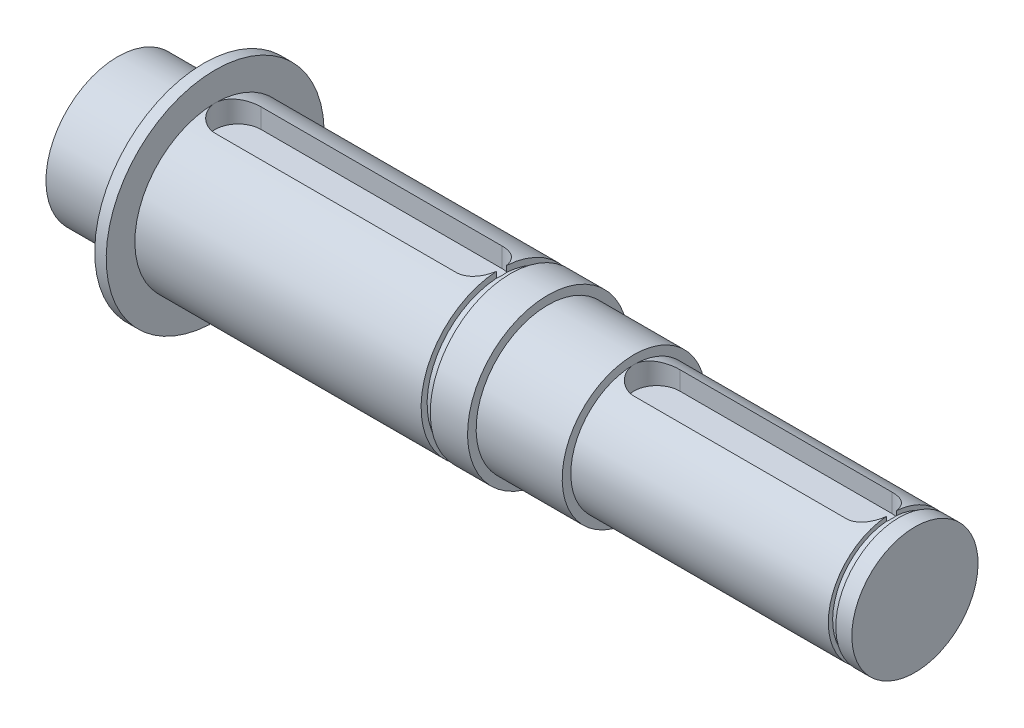
ISO-10303-21;
HEADER;
FILE_DESCRIPTION(('STEP AP214'),'2;1');
FILE_NAME('part.step','',(''),(''),'','','');
FILE_SCHEMA(('AUTOMOTIVE_DESIGN { 1 0 10303 214 1 1 1 1 }'));
ENDSEC;
DATA;
#1=APPLICATION_CONTEXT('core data for automotive mechanical design processes');
#2=APPLICATION_PROTOCOL_DEFINITION('international standard','automotive_design',2000,#1);
#3=PRODUCT_CONTEXT('',#1,'mechanical');
#4=PRODUCT('Part','Part','',(#3));
#5=PRODUCT_RELATED_PRODUCT_CATEGORY('part','',(#4));
#6=PRODUCT_DEFINITION_FORMATION('','',#4);
#7=PRODUCT_DEFINITION_CONTEXT('part definition',#1,'design');
#8=PRODUCT_DEFINITION('design','',#6,#7);
#9=PRODUCT_DEFINITION_SHAPE('','',#8);
#10=(LENGTH_UNIT() NAMED_UNIT(*) SI_UNIT(.MILLI.,.METRE.));
#11=(NAMED_UNIT(*) PLANE_ANGLE_UNIT() SI_UNIT($,.RADIAN.));
#12=(NAMED_UNIT(*) SI_UNIT($,.STERADIAN.) SOLID_ANGLE_UNIT());
#13=UNCERTAINTY_MEASURE_WITH_UNIT(LENGTH_MEASURE(1.E-05),#10,'distance_accuracy_value','');
#14=(GEOMETRIC_REPRESENTATION_CONTEXT(3) GLOBAL_UNCERTAINTY_ASSIGNED_CONTEXT((#13)) GLOBAL_UNIT_ASSIGNED_CONTEXT((#10,
#11,#12)) REPRESENTATION_CONTEXT('',''));
#15=CARTESIAN_POINT('',(0.,0.,0.));
#16=DIRECTION('',(0.,0.,1.));
#17=DIRECTION('',(1.,0.,0.));
#18=AXIS2_PLACEMENT_3D('',#15,#16,#17);
#19=CARTESIAN_POINT('',(139.,0.,0.));
#20=DIRECTION('',(1.,0.,0.));
#21=DIRECTION('',(0.,1.,0.));
#22=AXIS2_PLACEMENT_3D('',#19,#20,#21);
#23=CYLINDRICAL_SURFACE('',#22,11.);
#24=CARTESIAN_POINT('',(131.,10.2469507659596,-4.));
#25=CARTESIAN_POINT('',(131.108477558843,10.2469313120545,-4.00001506629618));
#26=CARTESIAN_POINT('',(131.216944401371,10.2486728711533,-3.99558759654818));
#27=CARTESIAN_POINT('',(131.433022618368,10.2555329689245,-3.97796511816532));
#28=CARTESIAN_POINT('',(131.540634252842,10.2606504381169,-3.96477288617617));
#29=CARTESIAN_POINT('',(131.753877275735,10.2740947544928,-3.92979740032968));
#30=CARTESIAN_POINT('',(131.85951412169,10.2824107118169,-3.90804329121768));
#31=CARTESIAN_POINT('',(132.068411897693,10.3019741161438,-3.85617600406601));
#32=CARTESIAN_POINT('',(132.171672716831,10.3132216996918,-3.82606243666697));
#33=CARTESIAN_POINT('',(132.476676115778,10.3508476988465,-3.72361404417547));
#34=CARTESIAN_POINT('',(132.674001570272,10.3811339859163,-3.6391113549248));
#35=CARTESIAN_POINT('',(133.05172943459,10.4486780931695,-3.44036098803053));
#36=CARTESIAN_POINT('',(133.232118828139,10.485941210624,-3.32609068287348));
#37=CARTESIAN_POINT('',(133.579274791177,10.5651741933544,-3.0653542941641));
#38=CARTESIAN_POINT('',(133.745145693355,10.6072762987954,-2.91773340595899));
#39=CARTESIAN_POINT('',(134.05039678297,10.690336539736,-2.59694586086138));
#40=CARTESIAN_POINT('',(134.189771967432,10.731294457945,-2.42377439039872));
#41=CARTESIAN_POINT('',(134.442363201265,10.8090212550311,-2.0500193923818));
#42=CARTESIAN_POINT('',(134.554608371619,10.845615877207,-1.84874018053143));
#43=CARTESIAN_POINT('',(134.743271668379,10.9089021162938,-1.42859821417925));
#44=CARTESIAN_POINT('',(134.819702463568,10.9355972343031,-1.20974170951164));
#45=CARTESIAN_POINT('',(134.931440204302,10.9751354864474,-0.77012611661072));
#46=CARTESIAN_POINT('',(134.968297491762,10.9884992496064,-0.5498088117063));
#47=CARTESIAN_POINT('',(135.004798750743,11.0017318475325,-0.105733961474889));
#48=CARTESIAN_POINT('',(135.004453431461,11.0016045658519,0.118022575285702));
#49=CARTESIAN_POINT('',(134.967483820974,10.9882062518061,0.551545099906522));
#50=CARTESIAN_POINT('',(134.932549652937,10.9755475501487,0.761477378236623));
#51=CARTESIAN_POINT('',(134.830223336823,10.9393023123449,1.17226394649134));
#52=CARTESIAN_POINT('',(134.76282934973,10.9157151570485,1.37311772136676));
#53=CARTESIAN_POINT('',(134.596658373248,10.8595473870101,1.76343292952034));
#54=CARTESIAN_POINT('',(134.497448272508,10.8268435212879,1.95269147493231));
#55=CARTESIAN_POINT('',(134.270826303062,10.7557777457742,2.31233599066249));
#56=CARTESIAN_POINT('',(134.143405640885,10.7174140730196,2.48271605149532));
#57=CARTESIAN_POINT('',(133.855777592485,10.6365116612934,2.80972574444224));
#58=CARTESIAN_POINT('',(133.694147769859,10.5938593571807,2.96507569246687));
#59=CARTESIAN_POINT('',(133.346694088341,10.5108815019074,3.24700232649086));
#60=CARTESIAN_POINT('',(133.160861316978,10.4705568158001,3.37356836574825));
#61=CARTESIAN_POINT('',(132.865589765369,10.4149302410634,3.54016240956463));
#62=CARTESIAN_POINT('',(132.763258238321,10.3970384333424,3.59223322579724));
#63=CARTESIAN_POINT('',(132.554188205134,10.3636323383352,3.6875022853032));
#64=CARTESIAN_POINT('',(132.44745158655,10.3481170458825,3.73070428236143));
#65=CARTESIAN_POINT('',(132.230436188959,10.3200005007807,3.80779139446806));
#66=CARTESIAN_POINT('',(132.120161615729,10.3073959242428,3.84168714521911));
#67=CARTESIAN_POINT('',(131.896828970337,10.2855215725494,3.89987270915221));
#68=CARTESIAN_POINT('',(131.783772182969,10.2762502878854,3.92416687098899));
#69=CARTESIAN_POINT('',(131.559278614184,10.2616115978763,3.96229165305801));
#70=CARTESIAN_POINT('',(131.447900257839,10.2561320834074,3.97642329254163));
#71=CARTESIAN_POINT('',(131.224351065922,10.2487922541277,3.99528154959869));
#72=CARTESIAN_POINT('',(131.112181182662,10.2469281542918,4.00001800323396));
#73=CARTESIAN_POINT('',(131.,10.2469507659596,4.));
#74=B_SPLINE_CURVE_WITH_KNOTS('',3,(#24,#25,#26,#27,#28,#29,#30,#31,#32,#33,#34,#35,#36,#37,#38,
#39,#40,#41,#42,#43,#44,#45,#46,#47,#48,#49,#50,#51,#52,#53,#54,#55,#56,#57,#58,#59,#60,#61,#62,
#63,#64,#65,#66,#67,#68,#69,#70,#71,#72,#73),.UNSPECIFIED.,.F.,.F.,(4,2,2,2,2,2,2,2,2,2,2,2,2,2,
2,2,2,2,2,2,2,2,2,2,4),(0.,0.325310395428341,0.650517782781802,0.974627603491242,
1.29875252283214,1.94591304532237,2.59356694227547,3.2685414937825,3.94364336903226,
4.64017640395483,5.33646286474438,6.00434645390944,6.67203778562602,7.30863725983086,
7.94527280491034,8.59097152050375,9.2368717899366,9.9184556128784,10.6002911350355,
10.9485318545547,11.2966248736592,11.6443184006235,11.9918542727889,12.3286166822483,
12.665026340001),.UNSPECIFIED.);
#75=CARTESIAN_POINT('',(131.,10.2469507659596,-4.));
#76=VERTEX_POINT('',#75);
#77=CARTESIAN_POINT('',(134.9,10.9640321050242,-0.888819441731495));
#78=VERTEX_POINT('',#77);
#79=EDGE_CURVE('E149',#76,#78,#74,.T.);
#80=ORIENTED_EDGE('',*,*,#79,.T.);
#81=CARTESIAN_POINT('',(134.9,0.,0.));
#82=DIRECTION('',(1.,0.,0.));
#83=DIRECTION('',(0.,0.,-1.));
#84=AXIS2_PLACEMENT_3D('',#81,#82,#83);
#85=CIRCLE('',#84,11.);
#86=CARTESIAN_POINT('',(134.9,10.9640321050242,0.888819441731495));
#87=VERTEX_POINT('',#86);
#88=EDGE_CURVE('E283',#87,#78,#85,.T.);
#89=ORIENTED_EDGE('',*,*,#88,.F.);
#90=CARTESIAN_POINT('',(131.,10.2469507659596,4.));
#91=VERTEX_POINT('',#90);
#92=EDGE_CURVE('E143',#87,#91,#74,.T.);
#93=ORIENTED_EDGE('',*,*,#92,.T.);
#94=DIRECTION('',(1.,0.,0.));
#95=VECTOR('',#94,1.);
#96=CARTESIAN_POINT('',(139.,10.2469507659596,4.));
#97=LINE('',#96,#95);
#98=CARTESIAN_POINT('',(94.,10.2469507659596,4.));
#99=VERTEX_POINT('',#98);
#100=EDGE_CURVE('E153',#91,#99,#97,.F.);
#101=ORIENTED_EDGE('',*,*,#100,.T.);
#102=CARTESIAN_POINT('',(94.,10.2469507659596,4.));
#103=CARTESIAN_POINT('',(93.8915183908045,10.2469313088078,4.00001506977391));
#104=CARTESIAN_POINT('',(93.7830474955696,10.2486729996172,3.99558726749334));
#105=CARTESIAN_POINT('',(93.5669612811812,10.2555336077063,3.97796347422631));
#106=CARTESIAN_POINT('',(93.459345701879,10.2606514549541,3.96477026132103));
#107=CARTESIAN_POINT('',(93.2461029251656,10.2740962494312,3.92979349193855));
#108=CARTESIAN_POINT('',(93.1404701496354,10.2824120667046,3.90803972287929));
#109=CARTESIAN_POINT('',(92.9315803663752,10.3019749589561,3.85617374589202));
#110=CARTESIAN_POINT('',(92.8283234693925,10.3132221702759,3.82606114918339));
#111=CARTESIAN_POINT('',(92.5233277125026,10.3508472263666,3.72361534297355));
#112=CARTESIAN_POINT('',(92.3260058739385,10.3811328432321,3.63911461020813));
#113=CARTESIAN_POINT('',(91.9482773582352,10.4486766889997,3.44036522594417));
#114=CARTESIAN_POINT('',(91.7678843391077,10.4859404764465,3.32609283088434));
#115=CARTESIAN_POINT('',(91.4207272911464,10.565173729875,3.06535609864592));
#116=CARTESIAN_POINT('',(91.2548582828432,10.6072753402285,2.91773783659032));
#117=CARTESIAN_POINT('',(90.9496063462328,10.6903355636367,2.59694889724248));
#118=CARTESIAN_POINT('',(90.810229036191,10.7312939326692,2.42377281354092));
#119=CARTESIAN_POINT('',(90.557594109822,10.8090346145524,2.04995938644408));
#120=CARTESIAN_POINT('',(90.4453178542128,10.8456408073915,1.84861930401743));
#121=CARTESIAN_POINT('',(90.2566746889288,10.9089199319407,1.42843537310003));
#122=CARTESIAN_POINT('',(90.1802710446905,10.9356030193405,1.20960970032285));
#123=CARTESIAN_POINT('',(90.0824782676799,10.9702130214291,0.824906160736883));
#124=CARTESIAN_POINT('',(90.0516215685283,10.9813163525238,0.661676869061396));
#125=CARTESIAN_POINT('',(90.0206894847039,10.9924895532884,0.414708991591336));
#126=CARTESIAN_POINT('',(90.0129375952788,10.9953003436412,0.332003558278102));
#127=CARTESIAN_POINT('',(90.0025907182284,10.99905775384,0.166205123390769));
#128=CARTESIAN_POINT('',(89.9999971996784,11.0000038426288,0.0831120181613245));
#129=CARTESIAN_POINT('',(90.,11.,0.));
#130=B_SPLINE_CURVE_WITH_KNOTS('',3,(#102,#103,#104,#105,#106,#107,#108,#109,#110,#111,#112,
#113,#114,#115,#116,#117,#118,#119,#120,#121,#122,#123,#124,#125,#126,#127,#128,#129),
.UNSPECIFIED.,.F.,.F.,(4,2,2,2,2,2,2,2,2,2,2,2,2,4),(0.,0.325322540076151,0.650542022622277,
0.974639733948174,1.29875252203267,1.94590088077385,2.59356694305212,3.26853366371063,
3.94364336959,4.6404106732846,5.33646290302635,5.83448417608322,6.08366631499306,
6.33291940943317),.UNSPECIFIED.);
#131=CARTESIAN_POINT('',(90.,11.,0.));
#132=VERTEX_POINT('',#131);
#133=EDGE_CURVE('E597',#99,#132,#130,.T.);
#134=ORIENTED_EDGE('',*,*,#133,.T.);
#135=CARTESIAN_POINT('',(90.,0.,0.));
#136=DIRECTION('',(1.,0.,0.));
#137=DIRECTION('',(0.,1.,0.));
#138=AXIS2_PLACEMENT_3D('',#135,#136,#137);
#139=CIRCLE('',#138,11.);
#140=EDGE_CURVE('E332',#132,#132,#139,.T.);
#141=ORIENTED_EDGE('',*,*,#140,.T.);
#142=CARTESIAN_POINT('',(90.,11.,0.));
#143=CARTESIAN_POINT('',(89.9999854891383,11.0000149916708,-0.108721842079888));
#144=CARTESIAN_POINT('',(90.0044323519986,10.9983884843296,-0.217434350861497));
#145=CARTESIAN_POINT('',(90.0221361408631,10.9919641737914,-0.43401788634526));
#146=CARTESIAN_POINT('',(90.0353907820769,10.9871671930358,-0.541889123938013));
#147=CARTESIAN_POINT('',(90.0705429146232,10.9745331672428,-0.755692199932069));
#148=CARTESIAN_POINT('',(90.0924134531418,10.966705603974,-0.861629018574376));
#149=CARTESIAN_POINT('',(90.1445693923375,10.9482307487078,-1.0711318718789));
#150=CARTESIAN_POINT('',(90.174855064899,10.9375833656054,-1.174697829824));
#151=CARTESIAN_POINT('',(90.277927852171,10.9018163234745,-1.48066734227163));
#152=CARTESIAN_POINT('',(90.3629812286641,10.8728527015342,-1.67864575330317));
#153=CARTESIAN_POINT('',(90.5630254399515,10.807585064042,-2.0574777040291));
#154=CARTESIAN_POINT('',(90.6780352082576,10.7712764094198,-2.23832031434452));
#155=CARTESIAN_POINT('',(90.9395605573123,10.6934636415097,-2.58505747930474));
#156=CARTESIAN_POINT('',(91.0870633482636,10.6518193196718,-2.75017705636823));
#157=CARTESIAN_POINT('',(91.4073040533014,10.5687365244827,-3.05396023614405));
#158=CARTESIAN_POINT('',(91.5800509063925,10.5272981294477,-3.19261442710165));
#159=CARTESIAN_POINT('',(91.9533838114672,10.4476909682968,-3.44439214128998));
#160=CARTESIAN_POINT('',(92.1547444292068,10.4096920907766,-3.55642551546129));
#161=CARTESIAN_POINT('',(92.5749389424856,10.3434997204737,-3.7446038230486));
#162=CARTESIAN_POINT('',(92.7937517191363,10.3152945911552,-3.82079138549897));
#163=CARTESIAN_POINT('',(93.1778885201178,10.2786412787822,-3.91808105220637));
#164=CARTESIAN_POINT('',(93.3405192721613,10.2668450373017,-3.94872051095344));
#165=CARTESIAN_POINT('',(93.5866254220781,10.2549568563094,-3.97944358734451));
#166=CARTESIAN_POINT('',(93.6690613413082,10.2519617842854,-3.9871452942556));
#167=CARTESIAN_POINT('',(93.834325034762,10.2479559005125,-3.99742575945992));
#168=CARTESIAN_POINT('',(93.9171529209689,10.2469456950317,-4.00000295249765));
#169=CARTESIAN_POINT('',(94.,10.2469507659596,-4.));
#170=B_SPLINE_CURVE_WITH_KNOTS('',3,(#142,#143,#144,#145,#146,#147,#148,#149,#150,#151,#152,
#153,#154,#155,#156,#157,#158,#159,#160,#161,#162,#163,#164,#165,#166,#167,#168,#169),
.UNSPECIFIED.,.F.,.F.,(4,2,2,2,2,2,2,2,2,2,2,2,2,4),(0.,0.326046662027655,0.652008778601526,
0.976959194650936,1.30192011073597,1.95092962138556,2.60035032885826,3.27320763015386,
3.9463037723606,4.64346725975823,5.33979954827606,5.83608037086294,6.08446198447538,
6.33291945328345),.UNSPECIFIED.);
#171=CARTESIAN_POINT('',(94.,10.2469507659596,-4.));
#172=VERTEX_POINT('',#171);
#173=EDGE_CURVE('E214',#132,#172,#170,.T.);
#174=ORIENTED_EDGE('',*,*,#173,.T.);
#175=DIRECTION('',(1.,0.,0.));
#176=VECTOR('',#175,1.);
#177=CARTESIAN_POINT('',(139.,10.2469507659596,-4.));
#178=LINE('',#177,#176);
#179=EDGE_CURVE('E150',#76,#172,#178,.F.);
#180=ORIENTED_EDGE('',*,*,#179,.F.);
#181=EDGE_LOOP('',(#80,#89,#93,#101,#134,#141,#174,#180));
#182=FACE_BOUND('',#181,.T.);
#183=ADVANCED_FACE('F34',(#182),#23,.T.);
#184=CARTESIAN_POINT('',(131.,19.,0.));
#185=DIRECTION('',(0.,-1.,0.));
#186=DIRECTION('',(0.,0.,-1.));
#187=AXIS2_PLACEMENT_3D('',#184,#185,#186);
#188=CYLINDRICAL_SURFACE('',#187,4.);
#189=ORIENTED_EDGE('',*,*,#92,.F.);
#190=DIRECTION('',(0.,-1.,0.));
#191=VECTOR('',#190,1.);
#192=CARTESIAN_POINT('',(134.9,19.,0.888819441731495));
#193=LINE('',#192,#191);
#194=CARTESIAN_POINT('',(134.9,10.2113906986267,0.888819441731495));
#195=VERTEX_POINT('',#194);
#196=EDGE_CURVE('E11',#87,#195,#193,.T.);
#197=ORIENTED_EDGE('',*,*,#196,.T.);
#198=CARTESIAN_POINT('',(134.9,10.2113906986267,0.888819441731495));
#199=CARTESIAN_POINT('',(134.923586205646,10.2204080921792,0.785395093825875));
#200=CARTESIAN_POINT('',(134.943059209452,10.2279063143699,0.680894245704587));
#201=CARTESIAN_POINT('',(134.973656986837,10.2397363268808,0.47045480717295));
#202=CARTESIAN_POINT('',(134.984778149528,10.2440667475936,0.36451561502884));
#203=CARTESIAN_POINT('',(134.99839367991,10.249372005433,0.154109137639295));
#204=CARTESIAN_POINT('',(135.001054486375,10.2504115808174,0.0496542371048219));
#205=CARTESIAN_POINT('',(134.998197173962,10.2492963958314,-0.159074896063757));
#206=CARTESIAN_POINT('',(134.99268342463,10.2471433420171,-0.263349195411882));
#207=CARTESIAN_POINT('',(134.97504750561,10.2402853729965,-0.454657713338996));
#208=CARTESIAN_POINT('',(134.964103558875,10.2360360256293,-0.541819427891574));
#209=CARTESIAN_POINT('',(134.936420484145,10.2253490817918,-0.715845314848179));
#210=CARTESIAN_POINT('',(134.919632881975,10.2188931900188,-0.802700658859418));
#211=CARTESIAN_POINT('',(134.9,10.2113906986267,-0.888819441731495));
#212=B_SPLINE_CURVE_WITH_KNOTS('',3,(#198,#199,#200,#201,#202,#203,#204,#205,#206,#207,#208,
#209,#210,#211),.UNSPECIFIED.,.F.,.F.,(4,2,2,2,2,2,4),(0.,0.319302148117637,0.638742265914744,
0.951857930783692,1.26480628625754,1.52844197792939,1.79431884717533),.UNSPECIFIED.);
#213=CARTESIAN_POINT('',(134.9,10.2113906986267,-0.888819441731495));
#214=VERTEX_POINT('',#213);
#215=EDGE_CURVE('E127',#195,#214,#212,.T.);
#216=ORIENTED_EDGE('',*,*,#215,.T.);
#217=DIRECTION('',(0.,-1.,0.));
#218=VECTOR('',#217,1.);
#219=CARTESIAN_POINT('',(134.9,19.,-0.888819441731495));
#220=LINE('',#219,#218);
#221=EDGE_CURVE('E42',#214,#78,#220,.F.);
#222=ORIENTED_EDGE('',*,*,#221,.T.);
#223=ORIENTED_EDGE('',*,*,#79,.F.);
#224=DIRECTION('',(0.,-1.,0.));
#225=VECTOR('',#224,1.);
#226=CARTESIAN_POINT('',(131.,19.,-4.));
#227=LINE('',#226,#225);
#228=CARTESIAN_POINT('',(131.,7.,-4.));
#229=VERTEX_POINT('',#228);
#230=EDGE_CURVE('E285',#76,#229,#227,.T.);
#231=ORIENTED_EDGE('',*,*,#230,.T.);
#232=CARTESIAN_POINT('',(131.,7.,0.));
#233=DIRECTION('',(0.,1.,0.));
#234=DIRECTION('',(0.,0.,1.));
#235=AXIS2_PLACEMENT_3D('',#232,#233,#234);
#236=CIRCLE('',#235,4.);
#237=CARTESIAN_POINT('',(131.,7.,4.));
#238=VERTEX_POINT('',#237);
#239=EDGE_CURVE('E287',#238,#229,#236,.T.);
#240=ORIENTED_EDGE('',*,*,#239,.F.);
#241=DIRECTION('',(0.,-1.,0.));
#242=VECTOR('',#241,1.);
#243=CARTESIAN_POINT('',(131.,19.,4.));
#244=LINE('',#243,#242);
#245=EDGE_CURVE('E145',#91,#238,#244,.T.);
#246=ORIENTED_EDGE('',*,*,#245,.F.);
#247=EDGE_LOOP('',(#189,#197,#216,#222,#223,#231,#240,#246));
#248=FACE_BOUND('',#247,.T.);
#249=ADVANCED_FACE('F141',(#248),#188,.F.);
#250=CARTESIAN_POINT('',(139.,0.,0.));
#251=DIRECTION('',(1.,0.,0.));
#252=DIRECTION('',(0.,1.,0.));
#253=AXIS2_PLACEMENT_3D('',#250,#251,#252);
#254=CYLINDRICAL_SURFACE('',#253,14.);
#255=CARTESIAN_POINT('',(68.5,0.,0.));
#256=DIRECTION('',(1.,0.,0.));
#257=DIRECTION('',(0.,0.,-1.));
#258=AXIS2_PLACEMENT_3D('',#255,#256,#257);
#259=CIRCLE('',#258,14.);
#260=CARTESIAN_POINT('',(68.5,0.,-14.));
#261=VERTEX_POINT('',#260);
#262=EDGE_CURVE('E608',#261,#261,#259,.T.);
#263=ORIENTED_EDGE('',*,*,#262,.T.);
#264=EDGE_LOOP('',(#263));
#265=FACE_BOUND('',#264,.T.);
#266=CARTESIAN_POINT('',(75.,0.,0.));
#267=DIRECTION('',(1.,0.,0.));
#268=DIRECTION('',(0.,1.,0.));
#269=AXIS2_PLACEMENT_3D('',#266,#267,#268);
#270=CIRCLE('',#269,14.);
#271=CARTESIAN_POINT('',(75.,14.,0.));
#272=VERTEX_POINT('',#271);
#273=EDGE_CURVE('E341',#272,#272,#270,.T.);
#274=ORIENTED_EDGE('',*,*,#273,.F.);
#275=EDGE_LOOP('',(#274));
#276=FACE_BOUND('',#275,.T.);
#277=ADVANCED_FACE('F173',(#265,#276),#254,.T.);
#278=CARTESIAN_POINT('',(75.,14.,0.));
#279=DIRECTION('',(1.,0.,0.));
#280=DIRECTION('',(0.,1.,0.));
#281=AXIS2_PLACEMENT_3D('',#278,#279,#280);
#282=PLANE('',#281);
#283=ORIENTED_EDGE('',*,*,#273,.T.);
#284=EDGE_LOOP('',(#283));
#285=FACE_BOUND('',#284,.T.);
#286=CARTESIAN_POINT('',(75.,0.,0.));
#287=DIRECTION('',(1.,0.,0.));
#288=DIRECTION('',(0.,1.,0.));
#289=AXIS2_PLACEMENT_3D('',#286,#287,#288);
#290=CIRCLE('',#289,12.5);
#291=CARTESIAN_POINT('',(75.,12.5,0.));
#292=VERTEX_POINT('',#291);
#293=EDGE_CURVE('E338',#292,#292,#290,.T.);
#294=ORIENTED_EDGE('',*,*,#293,.F.);
#295=EDGE_LOOP('',(#294));
#296=FACE_BOUND('',#295,.T.);
#297=ADVANCED_FACE('F249',(#285,#296),#282,.T.);
#298=CARTESIAN_POINT('',(139.,0.,0.));
#299=DIRECTION('',(1.,0.,0.));
#300=DIRECTION('',(0.,1.,0.));
#301=AXIS2_PLACEMENT_3D('',#298,#299,#300);
#302=CYLINDRICAL_SURFACE('',#301,12.5);
#303=ORIENTED_EDGE('',*,*,#293,.T.);
#304=EDGE_LOOP('',(#303));
#305=FACE_BOUND('',#304,.T.);
#306=CARTESIAN_POINT('',(90.,0.,0.));
#307=DIRECTION('',(1.,0.,0.));
#308=DIRECTION('',(0.,1.,0.));
#309=AXIS2_PLACEMENT_3D('',#306,#307,#308);
#310=CIRCLE('',#309,12.5);
#311=CARTESIAN_POINT('',(90.,12.5,0.));
#312=VERTEX_POINT('',#311);
#313=EDGE_CURVE('E335',#312,#312,#310,.T.);
#314=ORIENTED_EDGE('',*,*,#313,.F.);
#315=EDGE_LOOP('',(#314));
#316=FACE_BOUND('',#315,.T.);
#317=ADVANCED_FACE('F457',(#305,#316),#302,.T.);
#318=CARTESIAN_POINT('',(90.,12.5,0.));
#319=DIRECTION('',(1.,0.,0.));
#320=DIRECTION('',(0.,1.,0.));
#321=AXIS2_PLACEMENT_3D('',#318,#319,#320);
#322=PLANE('',#321);
#323=ORIENTED_EDGE('',*,*,#313,.T.);
#324=EDGE_LOOP('',(#323));
#325=FACE_BOUND('',#324,.T.);
#326=ORIENTED_EDGE('',*,*,#140,.F.);
#327=EDGE_LOOP('',(#326));
#328=FACE_BOUND('',#327,.T.);
#329=ADVANCED_FACE('F450',(#325,#328),#322,.T.);
#330=CARTESIAN_POINT('',(94.,19.,0.));
#331=DIRECTION('',(0.,-1.,0.));
#332=DIRECTION('',(0.,0.,-1.));
#333=AXIS2_PLACEMENT_3D('',#330,#331,#332);
#334=CYLINDRICAL_SURFACE('',#333,4.);
#335=ORIENTED_EDGE('',*,*,#133,.F.);
#336=DIRECTION('',(0.,-1.,0.));
#337=VECTOR('',#336,1.);
#338=CARTESIAN_POINT('',(94.,19.,4.));
#339=LINE('',#338,#337);
#340=CARTESIAN_POINT('',(94.,7.,4.));
#341=VERTEX_POINT('',#340);
#342=EDGE_CURVE('E308',#99,#341,#339,.T.);
#343=ORIENTED_EDGE('',*,*,#342,.T.);
#344=CARTESIAN_POINT('',(94.,7.,0.));
#345=DIRECTION('',(0.,1.,0.));
#346=DIRECTION('',(0.,0.,1.));
#347=AXIS2_PLACEMENT_3D('',#344,#345,#346);
#348=CIRCLE('',#347,4.);
#349=CARTESIAN_POINT('',(94.,7.,-4.));
#350=VERTEX_POINT('',#349);
#351=EDGE_CURVE('E604',#350,#341,#348,.T.);
#352=ORIENTED_EDGE('',*,*,#351,.F.);
#353=DIRECTION('',(0.,-1.,0.));
#354=VECTOR('',#353,1.);
#355=CARTESIAN_POINT('',(94.,19.,-4.));
#356=LINE('',#355,#354);
#357=EDGE_CURVE('E290',#172,#350,#356,.T.);
#358=ORIENTED_EDGE('',*,*,#357,.F.);
#359=ORIENTED_EDGE('',*,*,#173,.F.);
#360=EDGE_LOOP('',(#335,#343,#352,#358,#359));
#361=FACE_BOUND('',#360,.T.);
#362=ADVANCED_FACE('F443',(#361),#334,.F.);
#363=CARTESIAN_POINT('',(94.,19.,4.));
#364=DIRECTION('',(0.,0.,-1.));
#365=DIRECTION('',(-1.,0.,0.));
#366=AXIS2_PLACEMENT_3D('',#363,#364,#365);
#367=PLANE('',#366);
#368=ORIENTED_EDGE('',*,*,#245,.T.);
#369=DIRECTION('',(1.,0.,0.));
#370=VECTOR('',#369,1.);
#371=CARTESIAN_POINT('',(94.,7.,4.));
#372=LINE('',#371,#370);
#373=EDGE_CURVE('E299',#341,#238,#372,.T.);
#374=ORIENTED_EDGE('',*,*,#373,.F.);
#375=ORIENTED_EDGE('',*,*,#342,.F.);
#376=ORIENTED_EDGE('',*,*,#100,.F.);
#377=EDGE_LOOP('',(#368,#374,#375,#376));
#378=FACE_BOUND('',#377,.T.);
#379=ADVANCED_FACE('F176',(#378),#367,.T.);
#380=CARTESIAN_POINT('',(94.,19.,-4.));
#381=DIRECTION('',(0.,0.,-1.));
#382=DIRECTION('',(-1.,0.,0.));
#383=AXIS2_PLACEMENT_3D('',#380,#381,#382);
#384=PLANE('',#383);
#385=ORIENTED_EDGE('',*,*,#179,.T.);
#386=ORIENTED_EDGE('',*,*,#357,.T.);
#387=DIRECTION('',(1.,0.,0.));
#388=VECTOR('',#387,1.);
#389=CARTESIAN_POINT('',(94.,7.,-4.));
#390=LINE('',#389,#388);
#391=EDGE_CURVE('E297',#350,#229,#390,.T.);
#392=ORIENTED_EDGE('',*,*,#391,.T.);
#393=ORIENTED_EDGE('',*,*,#230,.F.);
#394=EDGE_LOOP('',(#385,#386,#392,#393));
#395=FACE_BOUND('',#394,.T.);
#396=ADVANCED_FACE('F174',(#395),#384,.F.);
#397=CARTESIAN_POINT('',(94.,7.,0.));
#398=DIRECTION('',(0.,1.,0.));
#399=DIRECTION('',(0.,0.,1.));
#400=AXIS2_PLACEMENT_3D('',#397,#398,#399);
#401=PLANE('',#400);
#402=ORIENTED_EDGE('',*,*,#351,.T.);
#403=ORIENTED_EDGE('',*,*,#373,.T.);
#404=ORIENTED_EDGE('',*,*,#239,.T.);
#405=ORIENTED_EDGE('',*,*,#391,.F.);
#406=EDGE_LOOP('',(#402,#403,#404,#405));
#407=FACE_BOUND('',#406,.T.);
#408=ADVANCED_FACE('F296',(#407),#401,.T.);
#409=CARTESIAN_POINT('',(66.9,0.,0.));
#410=DIRECTION('',(1.,0.,0.));
#411=DIRECTION('',(0.,0.,-1.));
#412=AXIS2_PLACEMENT_3D('',#409,#410,#411);
#413=PLANE('',#412);
#414=CARTESIAN_POINT('',(66.9,0.,0.));
#415=DIRECTION('',(1.,0.,0.));
#416=DIRECTION('',(0.,0.,-1.));
#417=AXIS2_PLACEMENT_3D('',#414,#415,#416);
#418=CIRCLE('',#417,14.);
#419=CARTESIAN_POINT('',(66.9,13.971757226634,0.888819441731556));
#420=VERTEX_POINT('',#419);
#421=CARTESIAN_POINT('',(66.9,13.971757226634,-0.888819441731556));
#422=VERTEX_POINT('',#421);
#423=EDGE_CURVE('E366',#420,#422,#418,.T.);
#424=ORIENTED_EDGE('',*,*,#423,.T.);
#425=DIRECTION('',(0.,-1.,0.));
#426=VECTOR('',#425,1.);
#427=CARTESIAN_POINT('',(66.9,19.,-0.888819441731556));
#428=LINE('',#427,#426);
#429=CARTESIAN_POINT('',(66.9,12.9194620631046,-0.888819441731556));
#430=VERTEX_POINT('',#429);
#431=EDGE_CURVE('E213',#430,#422,#428,.F.);
#432=ORIENTED_EDGE('',*,*,#431,.F.);
#433=CARTESIAN_POINT('',(66.9,0.,0.));
#434=DIRECTION('',(1.,0.,0.));
#435=DIRECTION('',(0.,0.,-1.));
#436=AXIS2_PLACEMENT_3D('',#433,#434,#435);
#437=CIRCLE('',#436,12.95);
#438=CARTESIAN_POINT('',(66.9,12.9194620631046,0.888819441731556));
#439=VERTEX_POINT('',#438);
#440=EDGE_CURVE('E55',#439,#430,#437,.T.);
#441=ORIENTED_EDGE('',*,*,#440,.F.);
#442=DIRECTION('',(0.,-1.,0.));
#443=VECTOR('',#442,1.);
#444=CARTESIAN_POINT('',(66.9,19.,0.888819441731556));
#445=LINE('',#444,#443);
#446=EDGE_CURVE('E132',#420,#439,#445,.T.);
#447=ORIENTED_EDGE('',*,*,#446,.F.);
#448=EDGE_LOOP('',(#424,#432,#441,#447));
#449=FACE_BOUND('',#448,.T.);
#450=ADVANCED_FACE('F202',(#449),#413,.T.);
#451=CARTESIAN_POINT('',(68.5,0.,0.));
#452=DIRECTION('',(1.,0.,0.));
#453=DIRECTION('',(0.,0.,-1.));
#454=AXIS2_PLACEMENT_3D('',#451,#452,#453);
#455=PLANE('',#454);
#456=CARTESIAN_POINT('',(68.5,0.,0.));
#457=DIRECTION('',(1.,0.,0.));
#458=DIRECTION('',(0.,0.,-1.));
#459=AXIS2_PLACEMENT_3D('',#456,#457,#458);
#460=CIRCLE('',#459,12.95);
#461=CARTESIAN_POINT('',(68.5,0.,-12.95));
#462=VERTEX_POINT('',#461);
#463=EDGE_CURVE('E613',#462,#462,#460,.T.);
#464=ORIENTED_EDGE('',*,*,#463,.T.);
#465=EDGE_LOOP('',(#464));
#466=FACE_BOUND('',#465,.T.);
#467=ORIENTED_EDGE('',*,*,#262,.F.);
#468=EDGE_LOOP('',(#467));
#469=FACE_BOUND('',#468,.T.);
#470=ADVANCED_FACE('F201',(#466,#469),#455,.F.);
#471=CARTESIAN_POINT('',(66.9,0.,0.));
#472=DIRECTION('',(1.,0.,0.));
#473=DIRECTION('',(0.,0.,-1.));
#474=AXIS2_PLACEMENT_3D('',#471,#472,#473);
#475=CYLINDRICAL_SURFACE('',#474,12.95);
#476=ORIENTED_EDGE('',*,*,#440,.T.);
#477=CARTESIAN_POINT('',(66.9,12.9194620631046,0.888819441731556));
#478=CARTESIAN_POINT('',(66.9241641124235,12.9267650295224,0.782856647717278));
#479=CARTESIAN_POINT('',(66.9440014789236,12.9328067626299,0.675816257583327));
#480=CARTESIAN_POINT('',(66.9749130396229,12.9422624566017,0.460314378545967));
#481=CARTESIAN_POINT('',(66.9859833207149,12.9456752440419,0.351852277005843));
#482=CARTESIAN_POINT('',(66.9991013671924,12.9497215834582,0.136437191904646));
#483=CARTESIAN_POINT('',(67.00131923581,12.9504075318637,0.0294955121641605));
#484=CARTESIAN_POINT('',(66.9971856933535,12.9491307093042,-0.184152893674054));
#485=CARTESIAN_POINT('',(66.9908390399394,12.9471694089069,-0.290859717262808));
#486=CARTESIAN_POINT('',(66.9720168482737,12.9413815222041,-0.479527919286962));
#487=CARTESIAN_POINT('',(66.9612324453311,12.9380711137022,-0.561678630193351));
#488=CARTESIAN_POINT('',(66.9345033749114,12.9299138175295,-0.725704903544167));
#489=CARTESIAN_POINT('',(66.9185199461623,12.9250553943994,-0.807573579060793));
#490=CARTESIAN_POINT('',(66.9,12.9194620631046,-0.888819441731556));
#491=B_SPLINE_CURVE_WITH_KNOTS('',3,(#477,#478,#479,#480,#481,#482,#483,#484,#485,#486,#487,
#488,#489,#490),.UNSPECIFIED.,.F.,.F.,(4,2,2,2,2,2,4),(0.,0.326694243891383,0.653534222671932,
0.974062682001746,1.29441315850142,1.54301171862742,1.79350789630551),.UNSPECIFIED.);
#492=EDGE_CURVE('E205',#439,#430,#491,.T.);
#493=ORIENTED_EDGE('',*,*,#492,.F.);
#494=EDGE_LOOP('',(#476,#493));
#495=FACE_BOUND('',#494,.T.);
#496=ORIENTED_EDGE('',*,*,#463,.F.);
#497=EDGE_LOOP('',(#496));
#498=FACE_BOUND('',#497,.T.);
#499=ADVANCED_FACE('F197',(#495,#498),#475,.T.);
#500=CARTESIAN_POINT('',(0.,0.,0.));
#501=DIRECTION('',(-1.,0.,0.));
#502=DIRECTION('',(0.,-1.,0.));
#503=AXIS2_PLACEMENT_3D('',#500,#501,#502);
#504=PLANE('',#503);
#505=CARTESIAN_POINT('',(0.,0.,0.));
#506=DIRECTION('',(1.,0.,0.));
#507=DIRECTION('',(0.,1.,0.));
#508=AXIS2_PLACEMENT_3D('',#505,#506,#507);
#509=CIRCLE('',#508,12.5);
#510=CARTESIAN_POINT('',(0.,12.5,0.));
#511=VERTEX_POINT('',#510);
#512=EDGE_CURVE('E355',#511,#511,#509,.T.);
#513=ORIENTED_EDGE('',*,*,#512,.F.);
#514=EDGE_LOOP('',(#513));
#515=FACE_BOUND('',#514,.T.);
#516=ADVANCED_FACE('F36',(#515),#504,.T.);
#517=CARTESIAN_POINT('',(139.,0.,0.));
#518=DIRECTION('',(1.,0.,0.));
#519=DIRECTION('',(0.,1.,0.));
#520=AXIS2_PLACEMENT_3D('',#517,#518,#519);
#521=CYLINDRICAL_SURFACE('',#520,12.5);
#522=ORIENTED_EDGE('',*,*,#512,.T.);
#523=EDGE_LOOP('',(#522));
#524=FACE_BOUND('',#523,.T.);
#525=CARTESIAN_POINT('',(15.,0.,0.));
#526=DIRECTION('',(1.,0.,0.));
#527=DIRECTION('',(0.,1.,0.));
#528=AXIS2_PLACEMENT_3D('',#525,#526,#527);
#529=CIRCLE('',#528,12.5);
#530=CARTESIAN_POINT('',(15.,12.5,0.));
#531=VERTEX_POINT('',#530);
#532=EDGE_CURVE('E353',#531,#531,#529,.T.);
#533=ORIENTED_EDGE('',*,*,#532,.F.);
#534=EDGE_LOOP('',(#533));
#535=FACE_BOUND('',#534,.T.);
#536=ADVANCED_FACE('F395',(#524,#535),#521,.T.);
#537=CARTESIAN_POINT('',(15.,14.,0.));
#538=DIRECTION('',(-1.,0.,0.));
#539=DIRECTION('',(0.,-1.,0.));
#540=AXIS2_PLACEMENT_3D('',#537,#538,#539);
#541=PLANE('',#540);
#542=ORIENTED_EDGE('',*,*,#532,.T.);
#543=EDGE_LOOP('',(#542));
#544=FACE_BOUND('',#543,.T.);
#545=CARTESIAN_POINT('',(15.,0.,0.));
#546=DIRECTION('',(1.,0.,0.));
#547=DIRECTION('',(0.,1.,0.));
#548=AXIS2_PLACEMENT_3D('',#545,#546,#547);
#549=CIRCLE('',#548,19.);
#550=CARTESIAN_POINT('',(15.,19.,0.));
#551=VERTEX_POINT('',#550);
#552=EDGE_CURVE('E350',#551,#551,#549,.T.);
#553=ORIENTED_EDGE('',*,*,#552,.F.);
#554=EDGE_LOOP('',(#553));
#555=FACE_BOUND('',#554,.T.);
#556=ADVANCED_FACE('F388',(#544,#555),#541,.T.);
#557=CARTESIAN_POINT('',(139.,0.,0.));
#558=DIRECTION('',(1.,0.,0.));
#559=DIRECTION('',(0.,1.,0.));
#560=AXIS2_PLACEMENT_3D('',#557,#558,#559);
#561=CYLINDRICAL_SURFACE('',#560,19.);
#562=ORIENTED_EDGE('',*,*,#552,.T.);
#563=EDGE_LOOP('',(#562));
#564=FACE_BOUND('',#563,.T.);
#565=CARTESIAN_POINT('',(17.,0.,0.));
#566=DIRECTION('',(1.,0.,0.));
#567=DIRECTION('',(0.,1.,0.));
#568=AXIS2_PLACEMENT_3D('',#565,#566,#567);
#569=CIRCLE('',#568,19.);
#570=CARTESIAN_POINT('',(17.,19.,0.));
#571=VERTEX_POINT('',#570);
#572=EDGE_CURVE('E347',#571,#571,#569,.T.);
#573=ORIENTED_EDGE('',*,*,#572,.F.);
#574=EDGE_LOOP('',(#573));
#575=FACE_BOUND('',#574,.T.);
#576=ADVANCED_FACE('F383',(#564,#575),#561,.T.);
#577=CARTESIAN_POINT('',(17.,19.,0.));
#578=DIRECTION('',(1.,0.,0.));
#579=DIRECTION('',(0.,1.,0.));
#580=AXIS2_PLACEMENT_3D('',#577,#578,#579);
#581=PLANE('',#580);
#582=ORIENTED_EDGE('',*,*,#572,.T.);
#583=EDGE_LOOP('',(#582));
#584=FACE_BOUND('',#583,.T.);
#585=CARTESIAN_POINT('',(17.,0.,0.));
#586=DIRECTION('',(1.,0.,0.));
#587=DIRECTION('',(0.,1.,0.));
#588=AXIS2_PLACEMENT_3D('',#585,#586,#587);
#589=CIRCLE('',#588,14.);
#590=CARTESIAN_POINT('',(17.,14.,0.));
#591=VERTEX_POINT('',#590);
#592=EDGE_CURVE('E344',#591,#591,#589,.T.);
#593=ORIENTED_EDGE('',*,*,#592,.F.);
#594=EDGE_LOOP('',(#593));
#595=FACE_BOUND('',#594,.T.);
#596=ADVANCED_FACE('F252',(#584,#595),#581,.T.);
#597=CARTESIAN_POINT('',(21.,19.,0.));
#598=DIRECTION('',(0.,-1.,0.));
#599=DIRECTION('',(0.,0.,-1.));
#600=AXIS2_PLACEMENT_3D('',#597,#598,#599);
#601=CYLINDRICAL_SURFACE('',#600,4.);
#602=CARTESIAN_POINT('',(21.,13.4164078649987,4.));
#603=CARTESIAN_POINT('',(20.8899593445617,13.4163934321272,4.0000134374781));
#604=CARTESIAN_POINT('',(20.7799271031128,13.4177613570236,3.99545938644264));
#605=CARTESIAN_POINT('',(20.5606972300437,13.4231547279479,3.97732079000552));
#606=CARTESIAN_POINT('',(20.4514994300099,13.427179622583,3.96373811828131));
#607=CARTESIAN_POINT('',(20.2349731338734,13.4377669502034,3.92769050614894));
#608=CARTESIAN_POINT('',(20.127640742251,13.4443231971897,3.90524721590964));
#609=CARTESIAN_POINT('',(19.9153598897377,13.4597628592722,3.85169506016458));
#610=CARTESIAN_POINT('',(19.8104114819352,13.4686463261376,3.82058600188661));
#611=CARTESIAN_POINT('',(19.5002857056962,13.4984068881322,3.71462838325496));
#612=CARTESIAN_POINT('',(19.2995741188054,13.5224074804698,3.62710670956421));
#613=CARTESIAN_POINT('',(18.9156890595443,13.5760100500548,3.42099709777644));
#614=CARTESIAN_POINT('',(18.7325233173019,13.6056144792319,3.30239555207701));
#615=CARTESIAN_POINT('',(18.3836330452311,13.6680341442193,3.03385736341641));
#616=CARTESIAN_POINT('',(18.2184796968932,13.7009124675883,2.8831919001528));
#617=CARTESIAN_POINT('',(17.9154021553135,13.7656370459004,2.55635384206476));
#618=CARTESIAN_POINT('',(17.777483216137,13.7974831007095,2.38017633679532));
#619=CARTESIAN_POINT('',(17.5303040796472,13.8572760629292,2.00323634464421));
#620=CARTESIAN_POINT('',(17.4216342730516,13.8851379798946,1.80207241215168));
#621=CARTESIAN_POINT('',(17.2399453321518,13.9330649446853,1.38345521230697));
#622=CARTESIAN_POINT('',(17.1668963529585,13.9531365167592,1.16601575821841));
#623=CARTESIAN_POINT('',(17.0754914047505,13.9785714355868,0.789575858579069));
#624=CARTESIAN_POINT('',(17.0472350289362,13.9865571355139,0.633085965451194));
#625=CARTESIAN_POINT('',(17.0094727873033,13.9972933950756,0.317760614673373));
#626=CARTESIAN_POINT('',(16.9999582550472,14.0000463743578,0.158926275370487));
#627=CARTESIAN_POINT('',(17.,14.,0.));
#628=B_SPLINE_CURVE_WITH_KNOTS('',3,(#602,#603,#604,#605,#606,#607,#608,#609,#610,#611,#612,
#613,#614,#615,#616,#617,#618,#619,#620,#621,#622,#623,#624,#625,#626,#627),.UNSPECIFIED.,.F.,
.F.,(4,2,2,2,2,2,2,2,2,2,2,2,4),(0.,0.33000488984895,0.659941316332419,0.989076511597484,
1.31821902914261,1.97574105328547,2.63355144060492,3.30831561740276,3.9832098428786,
4.67084909752221,5.35791121984491,5.83443142768569,6.31073123549609),.UNSPECIFIED.);
#629=CARTESIAN_POINT('',(21.,13.4164078649987,4.));
#630=VERTEX_POINT('',#629);
#631=EDGE_CURVE('E256',#630,#591,#628,.T.);
#632=ORIENTED_EDGE('',*,*,#631,.F.);
#633=DIRECTION('',(0.,-1.,0.));
#634=VECTOR('',#633,1.);
#635=CARTESIAN_POINT('',(21.,19.,4.));
#636=LINE('',#635,#634);
#637=CARTESIAN_POINT('',(21.,10.,4.));
#638=VERTEX_POINT('',#637);
#639=EDGE_CURVE('E328',#630,#638,#636,.T.);
#640=ORIENTED_EDGE('',*,*,#639,.T.);
#641=CARTESIAN_POINT('',(21.,10.,0.));
#642=DIRECTION('',(0.,1.,0.));
#643=DIRECTION('',(0.,0.,1.));
#644=AXIS2_PLACEMENT_3D('',#641,#642,#643);
#645=CIRCLE('',#644,4.);
#646=CARTESIAN_POINT('',(21.,10.,-4.));
#647=VERTEX_POINT('',#646);
#648=EDGE_CURVE('E310',#647,#638,#645,.T.);
#649=ORIENTED_EDGE('',*,*,#648,.F.);
#650=DIRECTION('',(0.,-1.,0.));
#651=VECTOR('',#650,1.);
#652=CARTESIAN_POINT('',(21.,19.,-4.));
#653=LINE('',#652,#651);
#654=CARTESIAN_POINT('',(21.,13.4164078649987,-4.));
#655=VERTEX_POINT('',#654);
#656=EDGE_CURVE('E322',#655,#647,#653,.T.);
#657=ORIENTED_EDGE('',*,*,#656,.F.);
#658=CARTESIAN_POINT('',(17.,14.,0.));
#659=CARTESIAN_POINT('',(16.9999867809463,14.0000122879939,-0.110133457837793));
#660=CARTESIAN_POINT('',(17.0045482965574,13.9987007062499,-0.220259025566228));
#661=CARTESIAN_POINT('',(17.0227182119908,13.9935210588999,-0.439680884404341));
#662=CARTESIAN_POINT('',(17.0363249317009,13.9896534680637,-0.548977325708556));
#663=CARTESIAN_POINT('',(17.0724412065102,13.979464712363,-0.765719670965624));
#664=CARTESIAN_POINT('',(17.094930236634,13.9731492046936,-0.873169249438833));
#665=CARTESIAN_POINT('',(17.1485959833007,13.9582468488763,-1.0856861560804));
#666=CARTESIAN_POINT('',(17.1797728464821,13.949659962391,-1.19075344400664));
#667=CARTESIAN_POINT('',(17.2859763033518,13.9208208089066,-1.50125367832883));
#668=CARTESIAN_POINT('',(17.3737148498423,13.8974784095358,-1.70221721606197));
#669=CARTESIAN_POINT('',(17.5803319366485,13.8450062796287,-2.0865218073031));
#670=CARTESIAN_POINT('',(17.6992221478418,13.8158743810639,-2.26985622084845));
#671=CARTESIAN_POINT('',(17.9680608017958,13.7540965552476,-2.61857086876639));
#672=CARTESIAN_POINT('',(18.1186727850601,13.7213841929149,-2.78342863308855));
#673=CARTESIAN_POINT('',(18.4452803802829,13.6565376659012,-3.08593204931604));
#674=CARTESIAN_POINT('',(18.6212822515014,13.6244036460001,-3.22357097118191));
#675=CARTESIAN_POINT('',(18.9980467810803,13.5636500942346,-3.47043697755912));
#676=CARTESIAN_POINT('',(19.1992412388363,13.535115610036,-3.5790273273352));
#677=CARTESIAN_POINT('',(19.6179150550306,13.4858113503487,-3.76055754481759));
#678=CARTESIAN_POINT('',(19.8353795765717,13.4650346016179,-3.83352944731136));
#679=CARTESIAN_POINT('',(20.2116120967656,13.4386748953873,-3.924736283725));
#680=CARTESIAN_POINT('',(20.3678522759482,13.430383956879,-3.95290477030514));
#681=CARTESIAN_POINT('',(20.6826972412163,13.4192241683275,-3.99055440862911));
#682=CARTESIAN_POINT('',(20.8413011547969,13.4163533652254,-4.0000422916816));
#683=CARTESIAN_POINT('',(21.,13.4164078649987,-4.));
#684=B_SPLINE_CURVE_WITH_KNOTS('',3,(#658,#659,#660,#661,#662,#663,#664,#665,#666,#667,#668,
#669,#670,#671,#672,#673,#674,#675,#676,#677,#678,#679,#680,#681,#682,#683),.UNSPECIFIED.,.F.,
.F.,(4,2,2,2,2,2,2,2,2,2,2,2,4),(0.,0.330284589448136,0.660507846935759,0.989972457453349,
1.31944262921197,1.97768454748985,2.63617342761382,3.31011945579538,3.98423191382647,
4.6720933624685,5.35933501191986,5.83511832365932,6.31073016176928),.UNSPECIFIED.);
#685=EDGE_CURVE('E154',#591,#655,#684,.T.);
#686=ORIENTED_EDGE('',*,*,#685,.F.);
#687=EDGE_LOOP('',(#632,#640,#649,#657,#686));
#688=FACE_BOUND('',#687,.T.);
#689=ADVANCED_FACE('F266',(#688),#601,.F.);
#690=CARTESIAN_POINT('',(21.,19.,4.));
#691=DIRECTION('',(0.,0.,-1.));
#692=DIRECTION('',(-1.,0.,0.));
#693=AXIS2_PLACEMENT_3D('',#690,#691,#692);
#694=PLANE('',#693);
#695=DIRECTION('',(0.,-1.,0.));
#696=VECTOR('',#695,1.);
#697=CARTESIAN_POINT('',(63.,19.,4.));
#698=LINE('',#697,#696);
#699=CARTESIAN_POINT('',(63.,13.4164078649987,4.));
#700=VERTEX_POINT('',#699);
#701=CARTESIAN_POINT('',(63.,10.,4.));
#702=VERTEX_POINT('',#701);
#703=EDGE_CURVE('E326',#700,#702,#698,.T.);
#704=ORIENTED_EDGE('',*,*,#703,.T.);
#705=DIRECTION('',(1.,0.,0.));
#706=VECTOR('',#705,1.);
#707=CARTESIAN_POINT('',(21.,10.,4.));
#708=LINE('',#707,#706);
#709=EDGE_CURVE('E313',#638,#702,#708,.T.);
#710=ORIENTED_EDGE('',*,*,#709,.F.);
#711=ORIENTED_EDGE('',*,*,#639,.F.);
#712=DIRECTION('',(1.,0.,0.));
#713=VECTOR('',#712,1.);
#714=CARTESIAN_POINT('',(139.,13.4164078649987,4.));
#715=LINE('',#714,#713);
#716=EDGE_CURVE('E240',#700,#630,#715,.F.);
#717=ORIENTED_EDGE('',*,*,#716,.F.);
#718=EDGE_LOOP('',(#704,#710,#711,#717));
#719=FACE_BOUND('',#718,.T.);
#720=ADVANCED_FACE('F227',(#719),#694,.T.);
#721=CARTESIAN_POINT('',(21.,10.,0.));
#722=DIRECTION('',(0.,1.,0.));
#723=DIRECTION('',(0.,0.,1.));
#724=AXIS2_PLACEMENT_3D('',#721,#722,#723);
#725=PLANE('',#724);
#726=ORIENTED_EDGE('',*,*,#648,.T.);
#727=ORIENTED_EDGE('',*,*,#709,.T.);
#728=CARTESIAN_POINT('',(63.,10.,0.));
#729=DIRECTION('',(0.,1.,0.));
#730=DIRECTION('',(0.,0.,1.));
#731=AXIS2_PLACEMENT_3D('',#728,#729,#730);
#732=CIRCLE('',#731,4.);
#733=CARTESIAN_POINT('',(63.,10.,-4.));
#734=VERTEX_POINT('',#733);
#735=EDGE_CURVE('E316',#702,#734,#732,.T.);
#736=ORIENTED_EDGE('',*,*,#735,.T.);
#737=DIRECTION('',(-1.,0.,0.));
#738=VECTOR('',#737,1.);
#739=CARTESIAN_POINT('',(21.,10.,-4.));
#740=LINE('',#739,#738);
#741=EDGE_CURVE('E319',#734,#647,#740,.T.);
#742=ORIENTED_EDGE('',*,*,#741,.T.);
#743=EDGE_LOOP('',(#726,#727,#736,#742));
#744=FACE_BOUND('',#743,.T.);
#745=ADVANCED_FACE('F376',(#744),#725,.T.);
#746=CARTESIAN_POINT('',(21.,19.,-4.));
#747=DIRECTION('',(0.,0.,1.));
#748=DIRECTION('',(1.,0.,0.));
#749=AXIS2_PLACEMENT_3D('',#746,#747,#748);
#750=PLANE('',#749);
#751=ORIENTED_EDGE('',*,*,#656,.T.);
#752=ORIENTED_EDGE('',*,*,#741,.F.);
#753=DIRECTION('',(0.,-1.,0.));
#754=VECTOR('',#753,1.);
#755=CARTESIAN_POINT('',(63.,19.,-4.));
#756=LINE('',#755,#754);
#757=CARTESIAN_POINT('',(63.,13.4164078649987,-4.));
#758=VERTEX_POINT('',#757);
#759=EDGE_CURVE('E324',#758,#734,#756,.T.);
#760=ORIENTED_EDGE('',*,*,#759,.F.);
#761=DIRECTION('',(1.,0.,0.));
#762=VECTOR('',#761,1.);
#763=CARTESIAN_POINT('',(139.,13.4164078649987,-4.));
#764=LINE('',#763,#762);
#765=EDGE_CURVE('E242',#655,#758,#764,.T.);
#766=ORIENTED_EDGE('',*,*,#765,.F.);
#767=EDGE_LOOP('',(#751,#752,#760,#766));
#768=FACE_BOUND('',#767,.T.);
#769=ADVANCED_FACE('F224',(#768),#750,.T.);
#770=CARTESIAN_POINT('',(63.,19.,0.));
#771=DIRECTION('',(0.,-1.,0.));
#772=DIRECTION('',(0.,0.,-1.));
#773=AXIS2_PLACEMENT_3D('',#770,#771,#772);
#774=CYLINDRICAL_SURFACE('',#773,4.);
#775=CARTESIAN_POINT('',(63.,13.4164078649987,-4.));
#776=CARTESIAN_POINT('',(63.1100369382651,13.4163934343768,-4.00001343424814));
#777=CARTESIAN_POINT('',(63.2200654598724,13.417761265702,-3.99545969266927));
#778=CARTESIAN_POINT('',(63.439287989373,13.4231542734801,-3.97732232121695));
#779=CARTESIAN_POINT('',(63.5484821655646,13.4271788988993,-3.96374056379899));
#780=CARTESIAN_POINT('',(63.7650086825825,13.4377658850065,-3.92769415038321));
#781=CARTESIAN_POINT('',(63.8723448107536,13.4443222312206,-3.90525054417986));
#782=CARTESIAN_POINT('',(64.0846330025544,13.4597622573638,-3.85169716989989));
#783=CARTESIAN_POINT('',(64.1895850129441,13.4686459892105,-3.82058720849962));
#784=CARTESIAN_POINT('',(64.4997176429995,13.4984072106126,-3.71462722105447));
#785=CARTESIAN_POINT('',(64.7004324003075,13.5224082651875,-3.62710377190381));
#786=CARTESIAN_POINT('',(65.0843168620671,13.5760110031023,-3.42099335445292));
#787=CARTESIAN_POINT('',(65.267479405898,13.6056149576788,-3.30239378136284));
#788=CARTESIAN_POINT('',(65.6163694048883,13.6680345915527,-3.03385514387188));
#789=CARTESIAN_POINT('',(65.78152502006,13.7009134336833,-2.88318637668458));
#790=CARTESIAN_POINT('',(66.0846013559799,13.7656378360175,-2.55635049218508));
#791=CARTESIAN_POINT('',(66.2225175601809,13.7974832241344,-2.38017915468806));
#792=CARTESIAN_POINT('',(66.46965938831,13.8572672913436,-2.0032879786442));
#793=CARTESIAN_POINT('',(66.57830390558,13.8851223262961,-1.80217262010785));
#794=CARTESIAN_POINT('',(66.7600070035731,13.9330517158678,-1.38360719231065));
#795=CARTESIAN_POINT('',(66.8330740946009,13.9531279309862,-1.16616104383813));
#796=CARTESIAN_POINT('',(66.9396683167644,13.9827902284191,-0.727119470413192));
#797=CARTESIAN_POINT('',(66.9741773114609,13.9926363331616,-0.505780313916727));
#798=CARTESIAN_POINT('',(67.0057735275053,14.0016419286283,-0.0602449633135632));
#799=CARTESIAN_POINT('',(67.0028671096311,14.0008032358133,0.163950738694262));
#800=CARTESIAN_POINT('',(66.9603871838748,13.9887201082301,0.601961495843511));
#801=CARTESIAN_POINT('',(66.9218765400541,13.9777773149304,0.815889248066121));
#802=CARTESIAN_POINT('',(66.8110088769656,13.9470775079522,1.23410663687489));
#803=CARTESIAN_POINT('',(66.7386501489513,13.9273200492871,1.43839578630405));
#804=CARTESIAN_POINT('',(66.5613811096927,13.8807804985664,1.83414901693189));
#805=CARTESIAN_POINT('',(66.4561231128315,13.853923872396,2.02544821255193));
#806=CARTESIAN_POINT('',(66.216306263055,13.7960546774321,2.38801825135016));
#807=CARTESIAN_POINT('',(66.0817414630191,13.7650412656095,2.55928501856377));
#808=CARTESIAN_POINT('',(65.7816132030873,13.7009177251593,2.88324485398744));
#809=CARTESIAN_POINT('',(65.6151296674918,13.6677722027509,3.03507809124176));
#810=CARTESIAN_POINT('',(65.2585735571279,13.6040627781022,3.30897556854652));
#811=CARTESIAN_POINT('',(65.0684943152248,13.573499609643,3.43103136574905));
#812=CARTESIAN_POINT('',(64.7688413281017,13.5321405016799,3.58945338157003));
#813=CARTESIAN_POINT('',(64.6660101565672,13.5190503394637,3.63832313759783));
#814=CARTESIAN_POINT('',(64.4563737412823,13.4948216745023,3.72718558970199));
#815=CARTESIAN_POINT('',(64.3495701318666,13.4836823796704,3.767181890327));
#816=CARTESIAN_POINT('',(64.1328613347894,13.463719461374,3.83791732102717));
#817=CARTESIAN_POINT('',(64.0229595198012,13.4548934199316,3.86866612224974));
#818=CARTESIAN_POINT('',(63.8008040600392,13.4398293634308,3.92067829243348));
#819=CARTESIAN_POINT('',(63.6885515301646,13.4335901494402,3.9419460559715));
#820=CARTESIAN_POINT('',(63.4802677978619,13.4246640965205,3.97223001063663));
#821=CARTESIAN_POINT('',(63.3844546408757,13.4215735027143,3.98264484818434));
#822=CARTESIAN_POINT('',(63.1924302194045,13.4174428037393,3.99652828145244));
#823=CARTESIAN_POINT('',(63.096219787408,13.4163995712304,4.00000747148811));
#824=CARTESIAN_POINT('',(63.,13.4164078649987,4.));
#825=B_SPLINE_CURVE_WITH_KNOTS('',3,(#775,#776,#777,#778,#779,#780,#781,#782,#783,#784,#785,
#786,#787,#788,#789,#790,#791,#792,#793,#794,#795,#796,#797,#798,#799,#800,#801,#802,#803,#804,
#805,#806,#807,#808,#809,#810,#811,#812,#813,#814,#815,#816,#817,#818,#819,#820,#821,#822,#823,
#824),.UNSPECIFIED.,.F.,.F.,(4,2,2,2,2,2,2,2,2,2,2,2,2,2,2,2,2,2,2,2,2,2,2,2,4),(0.,
0.329993743043623,0.659919065086366,0.98906537585001,1.31821902959231,1.97575167696558,
2.6335514401874,3.30832474645299,3.98320984263716,4.67064278038706,5.35791119973408,
6.02724874934373,6.69647251025092,7.34634193868018,7.99624417788575,8.65326120487289,
9.31041168231765,9.99056134493197,10.6709036279931,11.0143588121194,11.357674222404,
11.700629330619,12.0434253092463,12.3324405185762,12.6210139131113),.UNSPECIFIED.);
#826=EDGE_CURVE('E241',#420,#700,#825,.T.);
#827=ORIENTED_EDGE('',*,*,#826,.F.);
#828=ORIENTED_EDGE('',*,*,#446,.T.);
#829=ORIENTED_EDGE('',*,*,#492,.T.);
#830=ORIENTED_EDGE('',*,*,#431,.T.);
#831=EDGE_CURVE('E231',#758,#422,#825,.T.);
#832=ORIENTED_EDGE('',*,*,#831,.F.);
#833=ORIENTED_EDGE('',*,*,#759,.T.);
#834=ORIENTED_EDGE('',*,*,#735,.F.);
#835=ORIENTED_EDGE('',*,*,#703,.F.);
#836=EDGE_LOOP('',(#827,#828,#829,#830,#832,#833,#834,#835));
#837=FACE_BOUND('',#836,.T.);
#838=ADVANCED_FACE('F219',(#837),#774,.F.);
#839=ORIENTED_EDGE('',*,*,#831,.T.);
#840=ORIENTED_EDGE('',*,*,#423,.F.);
#841=ORIENTED_EDGE('',*,*,#826,.T.);
#842=ORIENTED_EDGE('',*,*,#716,.T.);
#843=ORIENTED_EDGE('',*,*,#631,.T.);
#844=ORIENTED_EDGE('',*,*,#592,.T.);
#845=ORIENTED_EDGE('',*,*,#685,.T.);
#846=ORIENTED_EDGE('',*,*,#765,.T.);
#847=EDGE_LOOP('',(#839,#840,#841,#842,#843,#844,#845,#846));
#848=FACE_BOUND('',#847,.T.);
#849=ADVANCED_FACE('F193',(#848),#254,.T.);
#850=CARTESIAN_POINT('',(134.9,0.,0.));
#851=DIRECTION('',(1.,0.,0.));
#852=DIRECTION('',(0.,0.,-1.));
#853=AXIS2_PLACEMENT_3D('',#850,#851,#852);
#854=PLANE('',#853);
#855=ORIENTED_EDGE('',*,*,#88,.T.);
#856=ORIENTED_EDGE('',*,*,#221,.F.);
#857=CARTESIAN_POINT('',(134.9,0.,0.));
#858=DIRECTION('',(1.,0.,0.));
#859=DIRECTION('',(0.,0.,-1.));
#860=AXIS2_PLACEMENT_3D('',#857,#858,#859);
#861=CIRCLE('',#860,10.25);
#862=EDGE_CURVE('E48',#195,#214,#861,.T.);
#863=ORIENTED_EDGE('',*,*,#862,.F.);
#864=ORIENTED_EDGE('',*,*,#196,.F.);
#865=EDGE_LOOP('',(#855,#856,#863,#864));
#866=FACE_BOUND('',#865,.T.);
#867=ADVANCED_FACE('F135',(#866),#854,.T.);
#868=CARTESIAN_POINT('',(136.2,0.,0.));
#869=DIRECTION('',(1.,0.,0.));
#870=DIRECTION('',(0.,0.,-1.));
#871=AXIS2_PLACEMENT_3D('',#868,#869,#870);
#872=PLANE('',#871);
#873=CARTESIAN_POINT('',(136.2,0.,0.));
#874=DIRECTION('',(1.,0.,0.));
#875=DIRECTION('',(0.,0.,-1.));
#876=AXIS2_PLACEMENT_3D('',#873,#874,#875);
#877=CIRCLE('',#876,10.25);
#878=CARTESIAN_POINT('',(136.2,0.,-10.25));
#879=VERTEX_POINT('',#878);
#880=EDGE_CURVE('E138',#879,#879,#877,.T.);
#881=ORIENTED_EDGE('',*,*,#880,.T.);
#882=EDGE_LOOP('',(#881));
#883=FACE_BOUND('',#882,.T.);
#884=CARTESIAN_POINT('',(136.2,0.,0.));
#885=DIRECTION('',(1.,0.,0.));
#886=DIRECTION('',(0.,0.,-1.));
#887=AXIS2_PLACEMENT_3D('',#884,#885,#886);
#888=CIRCLE('',#887,11.);
#889=CARTESIAN_POINT('',(136.2,0.,-11.));
#890=VERTEX_POINT('',#889);
#891=EDGE_CURVE('E137',#890,#890,#888,.T.);
#892=ORIENTED_EDGE('',*,*,#891,.F.);
#893=EDGE_LOOP('',(#892));
#894=FACE_BOUND('',#893,.T.);
#895=ADVANCED_FACE('F190',(#883,#894),#872,.F.);
#896=CARTESIAN_POINT('',(134.9,0.,0.));
#897=DIRECTION('',(1.,0.,0.));
#898=DIRECTION('',(0.,0.,-1.));
#899=AXIS2_PLACEMENT_3D('',#896,#897,#898);
#900=CYLINDRICAL_SURFACE('',#899,10.25);
#901=ORIENTED_EDGE('',*,*,#862,.T.);
#902=ORIENTED_EDGE('',*,*,#215,.F.);
#903=EDGE_LOOP('',(#901,#902));
#904=FACE_BOUND('',#903,.T.);
#905=ORIENTED_EDGE('',*,*,#880,.F.);
#906=EDGE_LOOP('',(#905));
#907=FACE_BOUND('',#906,.T.);
#908=ADVANCED_FACE('F128',(#904,#907),#900,.T.);
#909=CARTESIAN_POINT('',(139.,11.,0.));
#910=DIRECTION('',(1.,0.,0.));
#911=DIRECTION('',(0.,1.,0.));
#912=AXIS2_PLACEMENT_3D('',#909,#910,#911);
#913=PLANE('',#912);
#914=CARTESIAN_POINT('',(139.,0.,0.));
#915=DIRECTION('',(1.,0.,0.));
#916=DIRECTION('',(0.,1.,0.));
#917=AXIS2_PLACEMENT_3D('',#914,#915,#916);
#918=CIRCLE('',#917,11.);
#919=CARTESIAN_POINT('',(139.,11.,0.));
#920=VERTEX_POINT('',#919);
#921=EDGE_CURVE('E330',#920,#920,#918,.T.);
#922=ORIENTED_EDGE('',*,*,#921,.T.);
#923=EDGE_LOOP('',(#922));
#924=FACE_BOUND('',#923,.T.);
#925=ADVANCED_FACE('F189',(#924),#913,.T.);
#926=ORIENTED_EDGE('',*,*,#891,.T.);
#927=EDGE_LOOP('',(#926));
#928=FACE_BOUND('',#927,.T.);
#929=ORIENTED_EDGE('',*,*,#921,.F.);
#930=EDGE_LOOP('',(#929));
#931=FACE_BOUND('',#930,.T.);
#932=ADVANCED_FACE('F165',(#928,#931),#23,.T.);
#933=CLOSED_SHELL('',(#183,#249,#277,#297,#317,#329,#362,#379,#396,#408,#450,#470,#499,#516,
#536,#556,#576,#596,#689,#720,#745,#769,#838,#849,#867,#895,#908,#925,#932));
#934=MANIFOLD_SOLID_BREP('B2',#933);
#935=ADVANCED_BREP_SHAPE_REPRESENTATION('',(#18,#934),#14);
#936=SHAPE_DEFINITION_REPRESENTATION(#9,#935);
ENDSEC;
END-ISO-10303-21;
